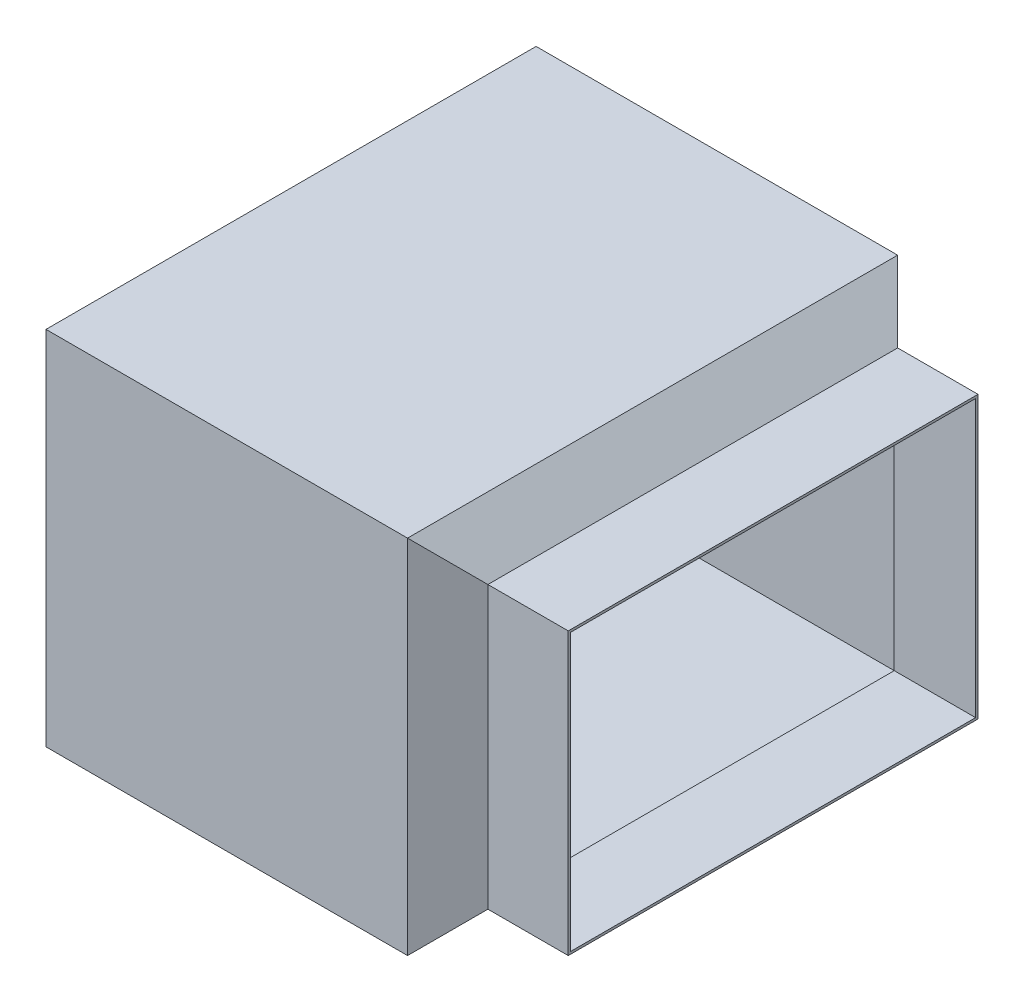
ISO-10303-21;
HEADER;
FILE_DESCRIPTION(('STEP AP214'),'2;1');
FILE_NAME('part.step','',(''),(''),'','','');
FILE_SCHEMA(('AUTOMOTIVE_DESIGN { 1 0 10303 214 1 1 1 1 }'));
ENDSEC;
DATA;
#1=APPLICATION_CONTEXT('core data for automotive mechanical design processes');
#2=APPLICATION_PROTOCOL_DEFINITION('international standard','automotive_design',2000,#1);
#3=PRODUCT_CONTEXT('',#1,'mechanical');
#4=PRODUCT('Part','Part','',(#3));
#5=PRODUCT_RELATED_PRODUCT_CATEGORY('part','',(#4));
#6=PRODUCT_DEFINITION_FORMATION('','',#4);
#7=PRODUCT_DEFINITION_CONTEXT('part definition',#1,'design');
#8=PRODUCT_DEFINITION('design','',#6,#7);
#9=PRODUCT_DEFINITION_SHAPE('','',#8);
#10=(LENGTH_UNIT() NAMED_UNIT(*) SI_UNIT(.MILLI.,.METRE.));
#11=(NAMED_UNIT(*) PLANE_ANGLE_UNIT() SI_UNIT($,.RADIAN.));
#12=(NAMED_UNIT(*) SI_UNIT($,.STERADIAN.) SOLID_ANGLE_UNIT());
#13=UNCERTAINTY_MEASURE_WITH_UNIT(LENGTH_MEASURE(1.E-05),#10,'distance_accuracy_value','');
#14=(GEOMETRIC_REPRESENTATION_CONTEXT(3) GLOBAL_UNCERTAINTY_ASSIGNED_CONTEXT((#13)) GLOBAL_UNIT_ASSIGNED_CONTEXT((#10,
#11,#12)) REPRESENTATION_CONTEXT('',''));
#15=CARTESIAN_POINT('',(0.,0.,0.));
#16=DIRECTION('',(0.,0.,1.));
#17=DIRECTION('',(1.,0.,0.));
#18=AXIS2_PLACEMENT_3D('',#15,#16,#17);
#19=CARTESIAN_POINT('',(50.,350.,255.));
#20=DIRECTION('',(-1.,0.,0.));
#21=DIRECTION('',(0.,0.,1.));
#22=AXIS2_PLACEMENT_3D('',#19,#20,#21);
#23=PLANE('',#22);
#24=DIRECTION('',(0.,0.,-1.));
#25=VECTOR('',#24,1.);
#26=CARTESIAN_POINT('',(50.,0.,255.));
#27=LINE('',#26,#25);
#28=CARTESIAN_POINT('',(50.,0.,255.));
#29=VERTEX_POINT('',#28);
#30=CARTESIAN_POINT('',(50.,0.,-255.));
#31=VERTEX_POINT('',#30);
#32=EDGE_CURVE('E236',#29,#31,#27,.T.);
#33=ORIENTED_EDGE('',*,*,#32,.T.);
#34=DIRECTION('',(0.,-1.,0.));
#35=VECTOR('',#34,1.);
#36=CARTESIAN_POINT('',(50.,350.,-255.));
#37=LINE('',#36,#35);
#38=CARTESIAN_POINT('',(50.,350.,-255.));
#39=VERTEX_POINT('',#38);
#40=EDGE_CURVE('E265',#39,#31,#37,.T.);
#41=ORIENTED_EDGE('',*,*,#40,.F.);
#42=DIRECTION('',(0.,0.,-1.));
#43=VECTOR('',#42,1.);
#44=CARTESIAN_POINT('',(50.,350.,255.));
#45=LINE('',#44,#43);
#46=CARTESIAN_POINT('',(50.,350.,255.));
#47=VERTEX_POINT('',#46);
#48=EDGE_CURVE('E237',#47,#39,#45,.T.);
#49=ORIENTED_EDGE('',*,*,#48,.F.);
#50=DIRECTION('',(0.,-1.,0.));
#51=VECTOR('',#50,1.);
#52=CARTESIAN_POINT('',(50.,350.,255.));
#53=LINE('',#52,#51);
#54=EDGE_CURVE('E248',#47,#29,#53,.T.);
#55=ORIENTED_EDGE('',*,*,#54,.T.);
#56=EDGE_LOOP('',(#33,#41,#49,#55));
#57=FACE_BOUND('',#56,.T.);
#58=DIRECTION('',(0.,0.,-1.));
#59=VECTOR('',#58,1.);
#60=CARTESIAN_POINT('',(50.,3.,0.));
#61=LINE('',#60,#59);
#62=CARTESIAN_POINT('',(50.,3.,252.));
#63=VERTEX_POINT('',#62);
#64=CARTESIAN_POINT('',(50.,3.,-252.));
#65=VERTEX_POINT('',#64);
#66=EDGE_CURVE('E139',#63,#65,#61,.T.);
#67=ORIENTED_EDGE('',*,*,#66,.F.);
#68=DIRECTION('',(0.,-1.,0.));
#69=VECTOR('',#68,1.);
#70=CARTESIAN_POINT('',(50.,350.,252.));
#71=LINE('',#70,#69);
#72=CARTESIAN_POINT('',(50.,347.,252.));
#73=VERTEX_POINT('',#72);
#74=EDGE_CURVE('E171',#73,#63,#71,.T.);
#75=ORIENTED_EDGE('',*,*,#74,.F.);
#76=DIRECTION('',(0.,0.,-1.));
#77=VECTOR('',#76,1.);
#78=CARTESIAN_POINT('',(50.,347.,0.));
#79=LINE('',#78,#77);
#80=CARTESIAN_POINT('',(50.,347.,-252.));
#81=VERTEX_POINT('',#80);
#82=EDGE_CURVE('E34',#73,#81,#79,.T.);
#83=ORIENTED_EDGE('',*,*,#82,.T.);
#84=DIRECTION('',(0.,-1.,0.));
#85=VECTOR('',#84,1.);
#86=CARTESIAN_POINT('',(50.,350.,-252.));
#87=LINE('',#86,#85);
#88=EDGE_CURVE('E165',#81,#65,#87,.T.);
#89=ORIENTED_EDGE('',*,*,#88,.T.);
#90=EDGE_LOOP('',(#67,#75,#83,#89));
#91=FACE_BOUND('',#90,.T.);
#92=ADVANCED_FACE('F17',(#57,#91),#23,.F.);
#93=CARTESIAN_POINT('',(-550.,0.,0.));
#94=DIRECTION('',(1.,0.,0.));
#95=DIRECTION('',(0.,0.,-1.));
#96=AXIS2_PLACEMENT_3D('',#93,#94,#95);
#97=PLANE('',#96);
#98=DIRECTION('',(0.,1.,0.));
#99=VECTOR('',#98,1.);
#100=CARTESIAN_POINT('',(-550.,-50.,305.));
#101=LINE('',#100,#99);
#102=CARTESIAN_POINT('',(-550.,-50.,305.));
#103=VERTEX_POINT('',#102);
#104=CARTESIAN_POINT('',(-550.,400.,305.));
#105=VERTEX_POINT('',#104);
#106=EDGE_CURVE('E215',#103,#105,#101,.T.);
#107=ORIENTED_EDGE('',*,*,#106,.T.);
#108=DIRECTION('',(0.,0.,-1.));
#109=VECTOR('',#108,1.);
#110=CARTESIAN_POINT('',(-550.,400.,-305.));
#111=LINE('',#110,#109);
#112=CARTESIAN_POINT('',(-550.,400.,-305.));
#113=VERTEX_POINT('',#112);
#114=EDGE_CURVE('E218',#105,#113,#111,.T.);
#115=ORIENTED_EDGE('',*,*,#114,.T.);
#116=DIRECTION('',(0.,-1.,0.));
#117=VECTOR('',#116,1.);
#118=CARTESIAN_POINT('',(-550.,-50.,-305.));
#119=LINE('',#118,#117);
#120=CARTESIAN_POINT('',(-550.,-50.,-305.));
#121=VERTEX_POINT('',#120);
#122=EDGE_CURVE('E220',#113,#121,#119,.T.);
#123=ORIENTED_EDGE('',*,*,#122,.T.);
#124=DIRECTION('',(0.,0.,1.));
#125=VECTOR('',#124,1.);
#126=CARTESIAN_POINT('',(-550.,-50.,-305.));
#127=LINE('',#126,#125);
#128=EDGE_CURVE('E222',#121,#103,#127,.T.);
#129=ORIENTED_EDGE('',*,*,#128,.T.);
#130=EDGE_LOOP('',(#107,#115,#123,#129));
#131=FACE_BOUND('',#130,.T.);
#132=DIRECTION('',(0.,1.,0.));
#133=VECTOR('',#132,1.);
#134=CARTESIAN_POINT('',(-550.,0.,302.));
#135=LINE('',#134,#133);
#136=CARTESIAN_POINT('',(-550.,-47.,302.));
#137=VERTEX_POINT('',#136);
#138=CARTESIAN_POINT('',(-550.,397.,302.));
#139=VERTEX_POINT('',#138);
#140=EDGE_CURVE('E182',#137,#139,#135,.T.);
#141=ORIENTED_EDGE('',*,*,#140,.F.);
#142=DIRECTION('',(0.,0.,1.));
#143=VECTOR('',#142,1.);
#144=CARTESIAN_POINT('',(-550.,-47.,0.));
#145=LINE('',#144,#143);
#146=CARTESIAN_POINT('',(-550.,-47.,-302.));
#147=VERTEX_POINT('',#146);
#148=EDGE_CURVE('E189',#147,#137,#145,.T.);
#149=ORIENTED_EDGE('',*,*,#148,.F.);
#150=DIRECTION('',(0.,-1.,0.));
#151=VECTOR('',#150,1.);
#152=CARTESIAN_POINT('',(-550.,0.,-302.));
#153=LINE('',#152,#151);
#154=CARTESIAN_POINT('',(-550.,397.,-302.));
#155=VERTEX_POINT('',#154);
#156=EDGE_CURVE('E212',#155,#147,#153,.T.);
#157=ORIENTED_EDGE('',*,*,#156,.F.);
#158=DIRECTION('',(0.,0.,-1.));
#159=VECTOR('',#158,1.);
#160=CARTESIAN_POINT('',(-550.,397.,0.));
#161=LINE('',#160,#159);
#162=EDGE_CURVE('E210',#139,#155,#161,.T.);
#163=ORIENTED_EDGE('',*,*,#162,.F.);
#164=EDGE_LOOP('',(#141,#149,#157,#163));
#165=FACE_BOUND('',#164,.T.);
#166=ADVANCED_FACE('F319',(#131,#165),#97,.F.);
#167=CARTESIAN_POINT('',(-50.,350.,-255.));
#168=DIRECTION('',(0.,0.,1.));
#169=DIRECTION('',(1.,0.,0.));
#170=AXIS2_PLACEMENT_3D('',#167,#168,#169);
#171=PLANE('',#170);
#172=DIRECTION('',(-1.,0.,0.));
#173=VECTOR('',#172,1.);
#174=CARTESIAN_POINT('',(-50.,0.,-255.));
#175=LINE('',#174,#173);
#176=CARTESIAN_POINT('',(-50.,0.,-255.));
#177=VERTEX_POINT('',#176);
#178=EDGE_CURVE('E251',#31,#177,#175,.T.);
#179=ORIENTED_EDGE('',*,*,#178,.T.);
#180=DIRECTION('',(0.,-1.,0.));
#181=VECTOR('',#180,1.);
#182=CARTESIAN_POINT('',(-50.,350.,-255.));
#183=LINE('',#182,#181);
#184=CARTESIAN_POINT('',(-50.,350.,-255.));
#185=VERTEX_POINT('',#184);
#186=EDGE_CURVE('E262',#185,#177,#183,.T.);
#187=ORIENTED_EDGE('',*,*,#186,.F.);
#188=DIRECTION('',(-1.,0.,0.));
#189=VECTOR('',#188,1.);
#190=CARTESIAN_POINT('',(-50.,350.,-255.));
#191=LINE('',#190,#189);
#192=EDGE_CURVE('E240',#39,#185,#191,.T.);
#193=ORIENTED_EDGE('',*,*,#192,.F.);
#194=ORIENTED_EDGE('',*,*,#40,.T.);
#195=EDGE_LOOP('',(#179,#187,#193,#194));
#196=FACE_BOUND('',#195,.T.);
#197=ADVANCED_FACE('F344',(#196),#171,.F.);
#198=CARTESIAN_POINT('',(-50.,350.,255.));
#199=DIRECTION('',(0.,0.,-1.));
#200=DIRECTION('',(-1.,0.,0.));
#201=AXIS2_PLACEMENT_3D('',#198,#199,#200);
#202=PLANE('',#201);
#203=DIRECTION('',(1.,0.,0.));
#204=VECTOR('',#203,1.);
#205=CARTESIAN_POINT('',(-50.,0.,255.));
#206=LINE('',#205,#204);
#207=CARTESIAN_POINT('',(-50.,0.,255.));
#208=VERTEX_POINT('',#207);
#209=EDGE_CURVE('E241',#208,#29,#206,.T.);
#210=ORIENTED_EDGE('',*,*,#209,.T.);
#211=ORIENTED_EDGE('',*,*,#54,.F.);
#212=DIRECTION('',(1.,0.,0.));
#213=VECTOR('',#212,1.);
#214=CARTESIAN_POINT('',(-50.,350.,255.));
#215=LINE('',#214,#213);
#216=CARTESIAN_POINT('',(-50.,350.,255.));
#217=VERTEX_POINT('',#216);
#218=EDGE_CURVE('E246',#217,#47,#215,.T.);
#219=ORIENTED_EDGE('',*,*,#218,.F.);
#220=DIRECTION('',(0.,-1.,0.));
#221=VECTOR('',#220,1.);
#222=CARTESIAN_POINT('',(-50.,350.,255.));
#223=LINE('',#222,#221);
#224=EDGE_CURVE('E259',#217,#208,#223,.T.);
#225=ORIENTED_EDGE('',*,*,#224,.T.);
#226=EDGE_LOOP('',(#210,#211,#219,#225));
#227=FACE_BOUND('',#226,.T.);
#228=ADVANCED_FACE('F297',(#227),#202,.F.);
#229=CARTESIAN_POINT('',(0.,350.,0.));
#230=DIRECTION('',(0.,-1.,0.));
#231=DIRECTION('',(0.,0.,-1.));
#232=AXIS2_PLACEMENT_3D('',#229,#230,#231);
#233=PLANE('',#232);
#234=ORIENTED_EDGE('',*,*,#48,.T.);
#235=ORIENTED_EDGE('',*,*,#192,.T.);
#236=DIRECTION('',(0.,0.,1.));
#237=VECTOR('',#236,1.);
#238=CARTESIAN_POINT('',(-50.,350.,255.));
#239=LINE('',#238,#237);
#240=EDGE_CURVE('E243',#185,#217,#239,.T.);
#241=ORIENTED_EDGE('',*,*,#240,.T.);
#242=ORIENTED_EDGE('',*,*,#218,.T.);
#243=EDGE_LOOP('',(#234,#235,#241,#242));
#244=FACE_BOUND('',#243,.T.);
#245=ADVANCED_FACE('F300',(#244),#233,.F.);
#246=CARTESIAN_POINT('',(0.,0.,0.));
#247=DIRECTION('',(0.,-1.,0.));
#248=DIRECTION('',(0.,0.,-1.));
#249=AXIS2_PLACEMENT_3D('',#246,#247,#248);
#250=PLANE('',#249);
#251=ORIENTED_EDGE('',*,*,#32,.F.);
#252=ORIENTED_EDGE('',*,*,#209,.F.);
#253=DIRECTION('',(0.,0.,1.));
#254=VECTOR('',#253,1.);
#255=CARTESIAN_POINT('',(-50.,0.,255.));
#256=LINE('',#255,#254);
#257=EDGE_CURVE('E253',#177,#208,#256,.T.);
#258=ORIENTED_EDGE('',*,*,#257,.F.);
#259=ORIENTED_EDGE('',*,*,#178,.F.);
#260=EDGE_LOOP('',(#251,#252,#258,#259));
#261=FACE_BOUND('',#260,.T.);
#262=ADVANCED_FACE('F293',(#261),#250,.T.);
#263=CARTESIAN_POINT('',(-550.,-50.,305.));
#264=DIRECTION('',(0.,0.,-1.));
#265=DIRECTION('',(-1.,0.,0.));
#266=AXIS2_PLACEMENT_3D('',#263,#264,#265);
#267=PLANE('',#266);
#268=DIRECTION('',(1.,0.,0.));
#269=VECTOR('',#268,1.);
#270=CARTESIAN_POINT('',(-550.,-50.,305.));
#271=LINE('',#270,#269);
#272=CARTESIAN_POINT('',(-100.,-50.,305.));
#273=VERTEX_POINT('',#272);
#274=EDGE_CURVE('E224',#103,#273,#271,.T.);
#275=ORIENTED_EDGE('',*,*,#274,.T.);
#276=DIRECTION('',(0.,1.,0.));
#277=VECTOR('',#276,1.);
#278=CARTESIAN_POINT('',(-100.,400.,305.));
#279=LINE('',#278,#277);
#280=CARTESIAN_POINT('',(-100.,400.,305.));
#281=VERTEX_POINT('',#280);
#282=EDGE_CURVE('E271',#273,#281,#279,.T.);
#283=ORIENTED_EDGE('',*,*,#282,.T.);
#284=DIRECTION('',(1.,0.,0.));
#285=VECTOR('',#284,1.);
#286=CARTESIAN_POINT('',(-550.,400.,305.));
#287=LINE('',#286,#285);
#288=EDGE_CURVE('E233',#105,#281,#287,.T.);
#289=ORIENTED_EDGE('',*,*,#288,.F.);
#290=ORIENTED_EDGE('',*,*,#106,.F.);
#291=EDGE_LOOP('',(#275,#283,#289,#290));
#292=FACE_BOUND('',#291,.T.);
#293=ADVANCED_FACE('F324',(#292),#267,.F.);
#294=CARTESIAN_POINT('',(-550.,400.,-305.));
#295=DIRECTION('',(0.,-1.,0.));
#296=DIRECTION('',(0.,0.,-1.));
#297=AXIS2_PLACEMENT_3D('',#294,#295,#296);
#298=PLANE('',#297);
#299=ORIENTED_EDGE('',*,*,#288,.T.);
#300=DIRECTION('',(0.,0.,-1.));
#301=VECTOR('',#300,1.);
#302=CARTESIAN_POINT('',(-100.,400.,-305.));
#303=LINE('',#302,#301);
#304=CARTESIAN_POINT('',(-100.,400.,-305.));
#305=VERTEX_POINT('',#304);
#306=EDGE_CURVE('E268',#281,#305,#303,.T.);
#307=ORIENTED_EDGE('',*,*,#306,.T.);
#308=DIRECTION('',(1.,0.,0.));
#309=VECTOR('',#308,1.);
#310=CARTESIAN_POINT('',(-550.,400.,-305.));
#311=LINE('',#310,#309);
#312=EDGE_CURVE('E230',#113,#305,#311,.T.);
#313=ORIENTED_EDGE('',*,*,#312,.F.);
#314=ORIENTED_EDGE('',*,*,#114,.F.);
#315=EDGE_LOOP('',(#299,#307,#313,#314));
#316=FACE_BOUND('',#315,.T.);
#317=ADVANCED_FACE('F313',(#316),#298,.F.);
#318=CARTESIAN_POINT('',(-550.,-50.,-305.));
#319=DIRECTION('',(0.,0.,1.));
#320=DIRECTION('',(0.,-1.,0.));
#321=AXIS2_PLACEMENT_3D('',#318,#319,#320);
#322=PLANE('',#321);
#323=ORIENTED_EDGE('',*,*,#312,.T.);
#324=DIRECTION('',(0.,-1.,0.));
#325=VECTOR('',#324,1.);
#326=CARTESIAN_POINT('',(-100.,-50.,-305.));
#327=LINE('',#326,#325);
#328=CARTESIAN_POINT('',(-100.,-50.,-305.));
#329=VERTEX_POINT('',#328);
#330=EDGE_CURVE('E26',#305,#329,#327,.T.);
#331=ORIENTED_EDGE('',*,*,#330,.T.);
#332=DIRECTION('',(1.,0.,0.));
#333=VECTOR('',#332,1.);
#334=CARTESIAN_POINT('',(-550.,-50.,-305.));
#335=LINE('',#334,#333);
#336=EDGE_CURVE('E227',#121,#329,#335,.T.);
#337=ORIENTED_EDGE('',*,*,#336,.F.);
#338=ORIENTED_EDGE('',*,*,#122,.F.);
#339=EDGE_LOOP('',(#323,#331,#337,#338));
#340=FACE_BOUND('',#339,.T.);
#341=ADVANCED_FACE('F316',(#340),#322,.F.);
#342=CARTESIAN_POINT('',(-550.,-50.,-305.));
#343=DIRECTION('',(0.,1.,0.));
#344=DIRECTION('',(0.,0.,1.));
#345=AXIS2_PLACEMENT_3D('',#342,#343,#344);
#346=PLANE('',#345);
#347=ORIENTED_EDGE('',*,*,#336,.T.);
#348=DIRECTION('',(0.,0.,1.));
#349=VECTOR('',#348,1.);
#350=CARTESIAN_POINT('',(-100.,-50.,305.));
#351=LINE('',#350,#349);
#352=EDGE_CURVE('E11',#329,#273,#351,.T.);
#353=ORIENTED_EDGE('',*,*,#352,.T.);
#354=ORIENTED_EDGE('',*,*,#274,.F.);
#355=ORIENTED_EDGE('',*,*,#128,.F.);
#356=EDGE_LOOP('',(#347,#353,#354,#355));
#357=FACE_BOUND('',#356,.T.);
#358=ADVANCED_FACE('F326',(#357),#346,.F.);
#359=CARTESIAN_POINT('',(-100.,-50.,-305.));
#360=DIRECTION('',(0.707106781186549,-0.707106781186546,0.));
#361=DIRECTION('',(0.,0.,-1.));
#362=AXIS2_PLACEMENT_3D('',#359,#360,#361);
#363=PLANE('',#362);
#364=DIRECTION('',(0.577350269189624,0.577350269189627,0.577350269189627));
#365=VECTOR('',#364,1.);
#366=CARTESIAN_POINT('',(-100.,-50.,-305.));
#367=LINE('',#366,#365);
#368=EDGE_CURVE('E276',#177,#329,#367,.F.);
#369=ORIENTED_EDGE('',*,*,#368,.F.);
#370=ORIENTED_EDGE('',*,*,#257,.T.);
#371=DIRECTION('',(-0.577350269189624,-0.577350269189627,0.577350269189627));
#372=VECTOR('',#371,1.);
#373=CARTESIAN_POINT('',(103.333333333333,153.333333333334,101.666666666666));
#374=LINE('',#373,#372);
#375=EDGE_CURVE('E21',#273,#208,#374,.F.);
#376=ORIENTED_EDGE('',*,*,#375,.F.);
#377=ORIENTED_EDGE('',*,*,#352,.F.);
#378=EDGE_LOOP('',(#369,#370,#376,#377));
#379=FACE_BOUND('',#378,.T.);
#380=ADVANCED_FACE('F19',(#379),#363,.T.);
#381=CARTESIAN_POINT('',(-100.,-50.,305.));
#382=DIRECTION('',(0.707106781186549,0.,0.707106781186546));
#383=DIRECTION('',(0.,-1.,0.));
#384=AXIS2_PLACEMENT_3D('',#381,#382,#383);
#385=PLANE('',#384);
#386=ORIENTED_EDGE('',*,*,#375,.T.);
#387=ORIENTED_EDGE('',*,*,#224,.F.);
#388=DIRECTION('',(-0.577350269189624,0.577350269189627,0.577350269189627));
#389=VECTOR('',#388,1.);
#390=CARTESIAN_POINT('',(50.,250.,155.));
#391=LINE('',#390,#389);
#392=EDGE_CURVE('E275',#281,#217,#391,.F.);
#393=ORIENTED_EDGE('',*,*,#392,.F.);
#394=ORIENTED_EDGE('',*,*,#282,.F.);
#395=EDGE_LOOP('',(#386,#387,#393,#394));
#396=FACE_BOUND('',#395,.T.);
#397=ADVANCED_FACE('F286',(#396),#385,.T.);
#398=CARTESIAN_POINT('',(-100.,-50.,-305.));
#399=DIRECTION('',(0.707106781186549,0.,-0.707106781186546));
#400=DIRECTION('',(0.,1.,0.));
#401=AXIS2_PLACEMENT_3D('',#398,#399,#400);
#402=PLANE('',#401);
#403=ORIENTED_EDGE('',*,*,#368,.T.);
#404=ORIENTED_EDGE('',*,*,#330,.F.);
#405=DIRECTION('',(0.577350269189624,-0.577350269189627,0.577350269189627));
#406=VECTOR('',#405,1.);
#407=CARTESIAN_POINT('',(50.,250.,-155.));
#408=LINE('',#407,#406);
#409=EDGE_CURVE('E185',#185,#305,#408,.F.);
#410=ORIENTED_EDGE('',*,*,#409,.F.);
#411=ORIENTED_EDGE('',*,*,#186,.T.);
#412=EDGE_LOOP('',(#403,#404,#410,#411));
#413=FACE_BOUND('',#412,.T.);
#414=ADVANCED_FACE('F308',(#413),#402,.T.);
#415=CARTESIAN_POINT('',(-100.,400.,-305.));
#416=DIRECTION('',(0.707106781186549,0.707106781186546,0.));
#417=DIRECTION('',(0.,0.,1.));
#418=AXIS2_PLACEMENT_3D('',#415,#416,#417);
#419=PLANE('',#418);
#420=ORIENTED_EDGE('',*,*,#392,.T.);
#421=ORIENTED_EDGE('',*,*,#240,.F.);
#422=ORIENTED_EDGE('',*,*,#409,.T.);
#423=ORIENTED_EDGE('',*,*,#306,.F.);
#424=EDGE_LOOP('',(#420,#421,#422,#423));
#425=FACE_BOUND('',#424,.T.);
#426=ADVANCED_FACE('F306',(#425),#419,.T.);
#427=CARTESIAN_POINT('',(-50.,350.,-252.));
#428=DIRECTION('',(0.,0.,1.));
#429=DIRECTION('',(1.,0.,0.));
#430=AXIS2_PLACEMENT_3D('',#427,#428,#429);
#431=PLANE('',#430);
#432=DIRECTION('',(-1.,0.,0.));
#433=VECTOR('',#432,1.);
#434=CARTESIAN_POINT('',(0.,3.,-252.));
#435=LINE('',#434,#433);
#436=CARTESIAN_POINT('',(-51.2426406871196,2.99999999999994,-252.));
#437=VERTEX_POINT('',#436);
#438=EDGE_CURVE('E133',#65,#437,#435,.T.);
#439=ORIENTED_EDGE('',*,*,#438,.F.);
#440=ORIENTED_EDGE('',*,*,#88,.F.);
#441=DIRECTION('',(-1.,0.,0.));
#442=VECTOR('',#441,1.);
#443=CARTESIAN_POINT('',(0.,347.,-252.));
#444=LINE('',#443,#442);
#445=CARTESIAN_POINT('',(-51.2426406871196,347.,-252.));
#446=VERTEX_POINT('',#445);
#447=EDGE_CURVE('E164',#81,#446,#444,.T.);
#448=ORIENTED_EDGE('',*,*,#447,.T.);
#449=DIRECTION('',(0.,-1.,0.));
#450=VECTOR('',#449,1.);
#451=CARTESIAN_POINT('',(-51.2426406871197,-50.,-252.));
#452=LINE('',#451,#450);
#453=EDGE_CURVE('E157',#446,#437,#452,.T.);
#454=ORIENTED_EDGE('',*,*,#453,.T.);
#455=EDGE_LOOP('',(#439,#440,#448,#454));
#456=FACE_BOUND('',#455,.T.);
#457=ADVANCED_FACE('F163',(#456),#431,.T.);
#458=CARTESIAN_POINT('',(-50.,350.,252.));
#459=DIRECTION('',(0.,0.,-1.));
#460=DIRECTION('',(-1.,0.,0.));
#461=AXIS2_PLACEMENT_3D('',#458,#459,#460);
#462=PLANE('',#461);
#463=DIRECTION('',(1.,0.,0.));
#464=VECTOR('',#463,1.);
#465=CARTESIAN_POINT('',(0.,3.,252.));
#466=LINE('',#465,#464);
#467=CARTESIAN_POINT('',(-51.2426406871195,3.,252.));
#468=VERTEX_POINT('',#467);
#469=EDGE_CURVE('E152',#468,#63,#466,.T.);
#470=ORIENTED_EDGE('',*,*,#469,.F.);
#471=DIRECTION('',(0.,-1.,0.));
#472=VECTOR('',#471,1.);
#473=CARTESIAN_POINT('',(-51.2426406871195,350.,252.));
#474=LINE('',#473,#472);
#475=CARTESIAN_POINT('',(-51.2426406871196,347.,252.));
#476=VERTEX_POINT('',#475);
#477=EDGE_CURVE('E166',#476,#468,#474,.T.);
#478=ORIENTED_EDGE('',*,*,#477,.F.);
#479=DIRECTION('',(1.,0.,0.));
#480=VECTOR('',#479,1.);
#481=CARTESIAN_POINT('',(0.,347.,252.));
#482=LINE('',#481,#480);
#483=EDGE_CURVE('E178',#476,#73,#482,.T.);
#484=ORIENTED_EDGE('',*,*,#483,.T.);
#485=ORIENTED_EDGE('',*,*,#74,.T.);
#486=EDGE_LOOP('',(#470,#478,#484,#485));
#487=FACE_BOUND('',#486,.T.);
#488=ADVANCED_FACE('F379',(#487),#462,.T.);
#489=CARTESIAN_POINT('',(0.,347.,0.));
#490=DIRECTION('',(0.,-1.,0.));
#491=DIRECTION('',(0.,0.,-1.));
#492=AXIS2_PLACEMENT_3D('',#489,#490,#491);
#493=PLANE('',#492);
#494=ORIENTED_EDGE('',*,*,#82,.F.);
#495=ORIENTED_EDGE('',*,*,#483,.F.);
#496=DIRECTION('',(0.,0.,1.));
#497=VECTOR('',#496,1.);
#498=CARTESIAN_POINT('',(-51.2426406871196,347.,0.));
#499=LINE('',#498,#497);
#500=EDGE_CURVE('E175',#446,#476,#499,.T.);
#501=ORIENTED_EDGE('',*,*,#500,.F.);
#502=ORIENTED_EDGE('',*,*,#447,.F.);
#503=EDGE_LOOP('',(#494,#495,#501,#502));
#504=FACE_BOUND('',#503,.T.);
#505=ADVANCED_FACE('F387',(#504),#493,.T.);
#506=CARTESIAN_POINT('',(0.,3.,0.));
#507=DIRECTION('',(0.,-1.,0.));
#508=DIRECTION('',(0.,0.,-1.));
#509=AXIS2_PLACEMENT_3D('',#506,#507,#508);
#510=PLANE('',#509);
#511=ORIENTED_EDGE('',*,*,#66,.T.);
#512=ORIENTED_EDGE('',*,*,#438,.T.);
#513=DIRECTION('',(0.,0.,1.));
#514=VECTOR('',#513,1.);
#515=CARTESIAN_POINT('',(-51.2426406871196,3.,0.));
#516=LINE('',#515,#514);
#517=EDGE_CURVE('E136',#437,#468,#516,.T.);
#518=ORIENTED_EDGE('',*,*,#517,.T.);
#519=ORIENTED_EDGE('',*,*,#469,.T.);
#520=EDGE_LOOP('',(#511,#512,#518,#519));
#521=FACE_BOUND('',#520,.T.);
#522=ADVANCED_FACE('F135',(#521),#510,.F.);
#523=CARTESIAN_POINT('',(-550.,-50.,302.));
#524=DIRECTION('',(0.,0.,-1.));
#525=DIRECTION('',(-1.,0.,0.));
#526=AXIS2_PLACEMENT_3D('',#523,#524,#525);
#527=PLANE('',#526);
#528=DIRECTION('',(1.,0.,0.));
#529=VECTOR('',#528,1.);
#530=CARTESIAN_POINT('',(-550.,-47.,302.));
#531=LINE('',#530,#529);
#532=CARTESIAN_POINT('',(-101.242640687119,-47.,302.));
#533=VERTEX_POINT('',#532);
#534=EDGE_CURVE('E186',#137,#533,#531,.T.);
#535=ORIENTED_EDGE('',*,*,#534,.F.);
#536=ORIENTED_EDGE('',*,*,#140,.T.);
#537=DIRECTION('',(1.,0.,0.));
#538=VECTOR('',#537,1.);
#539=CARTESIAN_POINT('',(-550.,397.,302.));
#540=LINE('',#539,#538);
#541=CARTESIAN_POINT('',(-101.242640687119,397.,302.));
#542=VERTEX_POINT('',#541);
#543=EDGE_CURVE('E192',#139,#542,#540,.T.);
#544=ORIENTED_EDGE('',*,*,#543,.T.);
#545=DIRECTION('',(0.,1.,0.));
#546=VECTOR('',#545,1.);
#547=CARTESIAN_POINT('',(-101.242640687119,-50.,302.));
#548=LINE('',#547,#546);
#549=EDGE_CURVE('E190',#533,#542,#548,.T.);
#550=ORIENTED_EDGE('',*,*,#549,.F.);
#551=EDGE_LOOP('',(#535,#536,#544,#550));
#552=FACE_BOUND('',#551,.T.);
#553=ADVANCED_FACE('F403',(#552),#527,.T.);
#554=CARTESIAN_POINT('',(-550.,397.,-305.));
#555=DIRECTION('',(0.,-1.,0.));
#556=DIRECTION('',(0.,0.,-1.));
#557=AXIS2_PLACEMENT_3D('',#554,#555,#556);
#558=PLANE('',#557);
#559=ORIENTED_EDGE('',*,*,#543,.F.);
#560=ORIENTED_EDGE('',*,*,#162,.T.);
#561=DIRECTION('',(1.,0.,0.));
#562=VECTOR('',#561,1.);
#563=CARTESIAN_POINT('',(-550.,397.,-302.));
#564=LINE('',#563,#562);
#565=CARTESIAN_POINT('',(-101.242640687119,397.,-302.));
#566=VERTEX_POINT('',#565);
#567=EDGE_CURVE('E195',#155,#566,#564,.T.);
#568=ORIENTED_EDGE('',*,*,#567,.T.);
#569=DIRECTION('',(0.,0.,-1.));
#570=VECTOR('',#569,1.);
#571=CARTESIAN_POINT('',(-101.242640687119,397.,-305.));
#572=LINE('',#571,#570);
#573=EDGE_CURVE('E168',#542,#566,#572,.T.);
#574=ORIENTED_EDGE('',*,*,#573,.F.);
#575=EDGE_LOOP('',(#559,#560,#568,#574));
#576=FACE_BOUND('',#575,.T.);
#577=ADVANCED_FACE('F411',(#576),#558,.T.);
#578=CARTESIAN_POINT('',(-550.,-50.,-302.));
#579=DIRECTION('',(0.,0.,1.));
#580=DIRECTION('',(0.,-1.,0.));
#581=AXIS2_PLACEMENT_3D('',#578,#579,#580);
#582=PLANE('',#581);
#583=ORIENTED_EDGE('',*,*,#567,.F.);
#584=ORIENTED_EDGE('',*,*,#156,.T.);
#585=DIRECTION('',(1.,0.,0.));
#586=VECTOR('',#585,1.);
#587=CARTESIAN_POINT('',(-550.,-47.,-302.));
#588=LINE('',#587,#586);
#589=CARTESIAN_POINT('',(-101.242640687119,-47.,-302.));
#590=VERTEX_POINT('',#589);
#591=EDGE_CURVE('E42',#147,#590,#588,.T.);
#592=ORIENTED_EDGE('',*,*,#591,.T.);
#593=DIRECTION('',(0.,-1.,0.));
#594=VECTOR('',#593,1.);
#595=CARTESIAN_POINT('',(-101.242640687119,-50.,-302.));
#596=LINE('',#595,#594);
#597=EDGE_CURVE('E160',#566,#590,#596,.T.);
#598=ORIENTED_EDGE('',*,*,#597,.F.);
#599=EDGE_LOOP('',(#583,#584,#592,#598));
#600=FACE_BOUND('',#599,.T.);
#601=ADVANCED_FACE('F420',(#600),#582,.T.);
#602=CARTESIAN_POINT('',(-550.,-47.,-305.));
#603=DIRECTION('',(0.,1.,0.));
#604=DIRECTION('',(0.,0.,1.));
#605=AXIS2_PLACEMENT_3D('',#602,#603,#604);
#606=PLANE('',#605);
#607=ORIENTED_EDGE('',*,*,#591,.F.);
#608=ORIENTED_EDGE('',*,*,#148,.T.);
#609=ORIENTED_EDGE('',*,*,#534,.T.);
#610=DIRECTION('',(0.,0.,1.));
#611=VECTOR('',#610,1.);
#612=CARTESIAN_POINT('',(-101.242640687119,-47.,-305.));
#613=LINE('',#612,#611);
#614=EDGE_CURVE('E183',#590,#533,#613,.T.);
#615=ORIENTED_EDGE('',*,*,#614,.F.);
#616=EDGE_LOOP('',(#607,#608,#609,#615));
#617=FACE_BOUND('',#616,.T.);
#618=ADVANCED_FACE('F429',(#617),#606,.T.);
#619=CARTESIAN_POINT('',(-102.12132034356,-47.8786796564404,-305.));
#620=DIRECTION('',(0.707106781186549,-0.707106781186546,0.));
#621=DIRECTION('',(0.,0.,-1.));
#622=AXIS2_PLACEMENT_3D('',#619,#620,#621);
#623=PLANE('',#622);
#624=DIRECTION('',(-0.577350269189624,-0.577350269189627,-0.577350269189627));
#625=VECTOR('',#624,1.);
#626=CARTESIAN_POINT('',(-102.828427124746,-48.5857864376269,-303.585786437627));
#627=LINE('',#626,#625);
#628=EDGE_CURVE('E149',#437,#590,#627,.T.);
#629=ORIENTED_EDGE('',*,*,#628,.T.);
#630=ORIENTED_EDGE('',*,*,#614,.T.);
#631=DIRECTION('',(0.577350269189624,0.577350269189627,-0.577350269189627));
#632=VECTOR('',#631,1.);
#633=CARTESIAN_POINT('',(-102.828427124746,-48.5857864376269,303.585786437627));
#634=LINE('',#633,#632);
#635=EDGE_CURVE('E151',#533,#468,#634,.T.);
#636=ORIENTED_EDGE('',*,*,#635,.T.);
#637=ORIENTED_EDGE('',*,*,#517,.F.);
#638=EDGE_LOOP('',(#629,#630,#636,#637));
#639=FACE_BOUND('',#638,.T.);
#640=ADVANCED_FACE('F148',(#639),#623,.F.);
#641=CARTESIAN_POINT('',(-102.12132034356,-50.,302.87867965644));
#642=DIRECTION('',(0.707106781186549,0.,0.707106781186546));
#643=DIRECTION('',(0.,-1.,0.));
#644=AXIS2_PLACEMENT_3D('',#641,#642,#643);
#645=PLANE('',#644);
#646=ORIENTED_EDGE('',*,*,#635,.F.);
#647=ORIENTED_EDGE('',*,*,#549,.T.);
#648=DIRECTION('',(0.577350269189624,-0.577350269189627,-0.577350269189627));
#649=VECTOR('',#648,1.);
#650=CARTESIAN_POINT('',(100.504906208587,195.252453104293,100.252453104293));
#651=LINE('',#650,#649);
#652=EDGE_CURVE('E161',#542,#476,#651,.T.);
#653=ORIENTED_EDGE('',*,*,#652,.T.);
#654=ORIENTED_EDGE('',*,*,#477,.T.);
#655=EDGE_LOOP('',(#646,#647,#653,#654));
#656=FACE_BOUND('',#655,.T.);
#657=ADVANCED_FACE('F445',(#656),#645,.F.);
#658=CARTESIAN_POINT('',(-102.12132034356,-50.,-302.878679656441));
#659=DIRECTION('',(0.707106781186549,0.,-0.707106781186546));
#660=DIRECTION('',(0.,1.,0.));
#661=AXIS2_PLACEMENT_3D('',#658,#659,#660);
#662=PLANE('',#661);
#663=ORIENTED_EDGE('',*,*,#628,.F.);
#664=ORIENTED_EDGE('',*,*,#453,.F.);
#665=DIRECTION('',(-0.577350269189624,0.577350269189627,-0.577350269189627));
#666=VECTOR('',#665,1.);
#667=CARTESIAN_POINT('',(-102.828427124746,398.585786437627,-303.585786437627));
#668=LINE('',#667,#666);
#669=EDGE_CURVE('E203',#446,#566,#668,.T.);
#670=ORIENTED_EDGE('',*,*,#669,.T.);
#671=ORIENTED_EDGE('',*,*,#597,.T.);
#672=EDGE_LOOP('',(#663,#664,#670,#671));
#673=FACE_BOUND('',#672,.T.);
#674=ADVANCED_FACE('F156',(#673),#662,.F.);
#675=CARTESIAN_POINT('',(-102.12132034356,397.878679656441,-305.));
#676=DIRECTION('',(0.707106781186549,0.707106781186546,0.));
#677=DIRECTION('',(0.,0.,1.));
#678=AXIS2_PLACEMENT_3D('',#675,#676,#677);
#679=PLANE('',#678);
#680=ORIENTED_EDGE('',*,*,#652,.F.);
#681=ORIENTED_EDGE('',*,*,#573,.T.);
#682=ORIENTED_EDGE('',*,*,#669,.F.);
#683=ORIENTED_EDGE('',*,*,#500,.T.);
#684=EDGE_LOOP('',(#680,#681,#682,#683));
#685=FACE_BOUND('',#684,.T.);
#686=ADVANCED_FACE('F461',(#685),#679,.F.);
#687=CLOSED_SHELL('',(#92,#166,#197,#228,#245,#262,#293,#317,#341,#358,#380,#397,#414,#426,#457,
#488,#505,#522,#553,#577,#601,#618,#640,#657,#674,#686));
#688=MANIFOLD_SOLID_BREP('B1',#687);
#689=ADVANCED_BREP_SHAPE_REPRESENTATION('',(#18,#688),#14);
#690=SHAPE_DEFINITION_REPRESENTATION(#9,#689);
ENDSEC;
END-ISO-10303-21;
